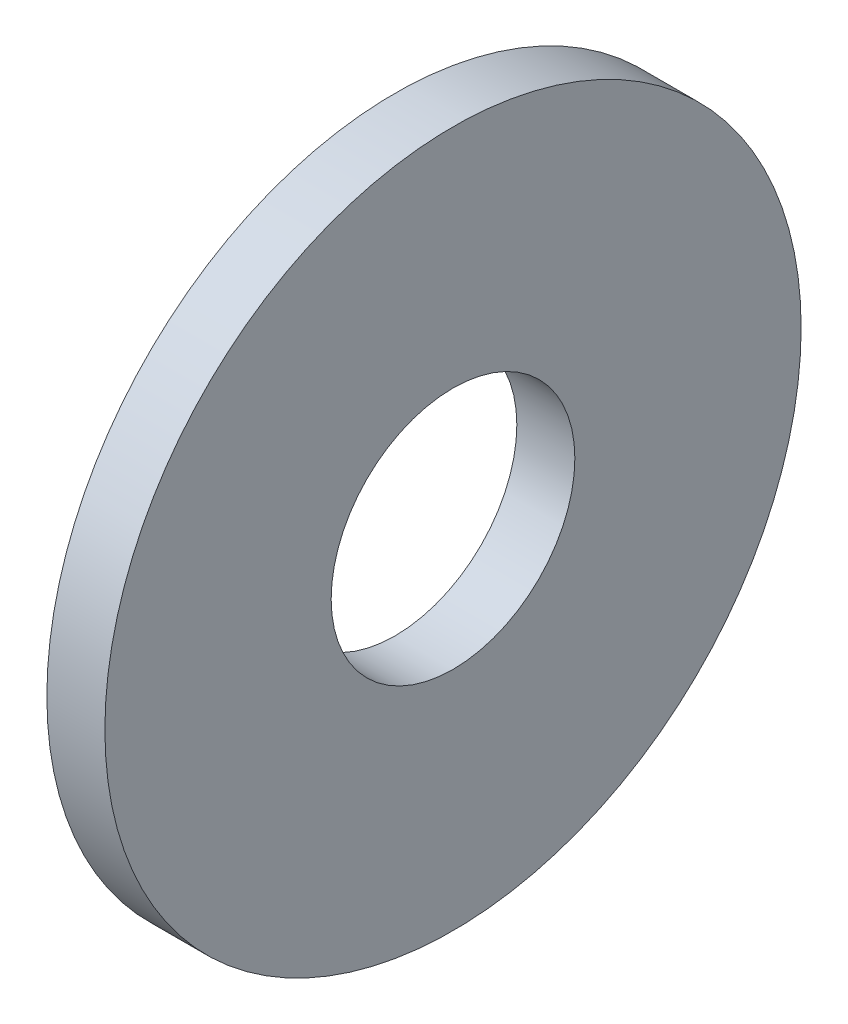
ISO-10303-21;
HEADER;
FILE_DESCRIPTION(('STEP AP214'),'2;1');
FILE_NAME('part.step','',(''),(''),'','','');
FILE_SCHEMA(('AUTOMOTIVE_DESIGN { 1 0 10303 214 1 1 1 1 }'));
ENDSEC;
DATA;
#1=APPLICATION_CONTEXT('core data for automotive mechanical design processes');
#2=APPLICATION_PROTOCOL_DEFINITION('international standard','automotive_design',2000,#1);
#3=PRODUCT_CONTEXT('',#1,'mechanical');
#4=PRODUCT('Part','Part','',(#3));
#5=PRODUCT_RELATED_PRODUCT_CATEGORY('part','',(#4));
#6=PRODUCT_DEFINITION_FORMATION('','',#4);
#7=PRODUCT_DEFINITION_CONTEXT('part definition',#1,'design');
#8=PRODUCT_DEFINITION('design','',#6,#7);
#9=PRODUCT_DEFINITION_SHAPE('','',#8);
#10=(LENGTH_UNIT() NAMED_UNIT(*) SI_UNIT(.MILLI.,.METRE.));
#11=(NAMED_UNIT(*) PLANE_ANGLE_UNIT() SI_UNIT($,.RADIAN.));
#12=(NAMED_UNIT(*) SI_UNIT($,.STERADIAN.) SOLID_ANGLE_UNIT());
#13=UNCERTAINTY_MEASURE_WITH_UNIT(LENGTH_MEASURE(1.E-05),#10,'distance_accuracy_value','');
#14=(GEOMETRIC_REPRESENTATION_CONTEXT(3) GLOBAL_UNCERTAINTY_ASSIGNED_CONTEXT((#13)) GLOBAL_UNIT_ASSIGNED_CONTEXT((#10,
#11,#12)) REPRESENTATION_CONTEXT('',''));
#15=CARTESIAN_POINT('',(0.,0.,0.));
#16=DIRECTION('',(0.,0.,1.));
#17=DIRECTION('',(1.,0.,0.));
#18=AXIS2_PLACEMENT_3D('',#15,#16,#17);
#19=CARTESIAN_POINT('',(-34.9249999999999,0.,0.));
#20=DIRECTION('',(-1.,0.,0.));
#21=DIRECTION('',(0.,0.,1.));
#22=AXIS2_PLACEMENT_3D('',#19,#20,#21);
#23=CYLINDRICAL_SURFACE('',#22,4.2);
#24=CARTESIAN_POINT('',(0.,0.,0.));
#25=DIRECTION('',(-1.,0.,0.));
#26=DIRECTION('',(0.,0.,1.));
#27=AXIS2_PLACEMENT_3D('',#24,#25,#26);
#28=CIRCLE('',#27,4.2);
#29=CARTESIAN_POINT('',(0.,0.,4.2));
#30=VERTEX_POINT('',#29);
#31=EDGE_CURVE('E10',#30,#30,#28,.T.);
#32=ORIENTED_EDGE('',*,*,#31,.F.);
#33=EDGE_LOOP('',(#32));
#34=FACE_BOUND('',#33,.T.);
#35=CARTESIAN_POINT('',(-2.,0.,0.));
#36=DIRECTION('',(-1.,0.,0.));
#37=DIRECTION('',(0.,0.,1.));
#38=AXIS2_PLACEMENT_3D('',#35,#36,#37);
#39=CIRCLE('',#38,4.2);
#40=CARTESIAN_POINT('',(-2.,0.,4.2));
#41=VERTEX_POINT('',#40);
#42=EDGE_CURVE('E44',#41,#41,#39,.T.);
#43=ORIENTED_EDGE('',*,*,#42,.T.);
#44=EDGE_LOOP('',(#43));
#45=FACE_BOUND('',#44,.T.);
#46=ADVANCED_FACE('F30',(#34,#45),#23,.F.);
#47=CARTESIAN_POINT('',(0.,4.2,0.));
#48=DIRECTION('',(-1.,0.,0.));
#49=DIRECTION('',(0.,0.,1.));
#50=AXIS2_PLACEMENT_3D('',#47,#48,#49);
#51=PLANE('',#50);
#52=CARTESIAN_POINT('',(0.,0.,0.));
#53=DIRECTION('',(-1.,0.,0.));
#54=DIRECTION('',(0.,0.,1.));
#55=AXIS2_PLACEMENT_3D('',#52,#53,#54);
#56=CIRCLE('',#55,12.);
#57=CARTESIAN_POINT('',(0.,0.,12.));
#58=VERTEX_POINT('',#57);
#59=EDGE_CURVE('E36',#58,#58,#56,.T.);
#60=ORIENTED_EDGE('',*,*,#59,.F.);
#61=EDGE_LOOP('',(#60));
#62=FACE_BOUND('',#61,.T.);
#63=ORIENTED_EDGE('',*,*,#31,.T.);
#64=EDGE_LOOP('',(#63));
#65=FACE_BOUND('',#64,.T.);
#66=ADVANCED_FACE('F59',(#62,#65),#51,.F.);
#67=CARTESIAN_POINT('',(-34.9249999999999,0.,0.));
#68=DIRECTION('',(-1.,0.,0.));
#69=DIRECTION('',(0.,0.,1.));
#70=AXIS2_PLACEMENT_3D('',#67,#68,#69);
#71=CYLINDRICAL_SURFACE('',#70,12.);
#72=CARTESIAN_POINT('',(-2.,0.,0.));
#73=DIRECTION('',(-1.,0.,0.));
#74=DIRECTION('',(0.,0.,1.));
#75=AXIS2_PLACEMENT_3D('',#72,#73,#74);
#76=CIRCLE('',#75,12.);
#77=CARTESIAN_POINT('',(-2.,0.,12.));
#78=VERTEX_POINT('',#77);
#79=EDGE_CURVE('E40',#78,#78,#76,.T.);
#80=ORIENTED_EDGE('',*,*,#79,.F.);
#81=EDGE_LOOP('',(#80));
#82=FACE_BOUND('',#81,.T.);
#83=ORIENTED_EDGE('',*,*,#59,.T.);
#84=EDGE_LOOP('',(#83));
#85=FACE_BOUND('',#84,.T.);
#86=ADVANCED_FACE('F54',(#82,#85),#71,.T.);
#87=CARTESIAN_POINT('',(-2.,12.,0.));
#88=DIRECTION('',(1.,0.,0.));
#89=DIRECTION('',(0.,0.,-1.));
#90=AXIS2_PLACEMENT_3D('',#87,#88,#89);
#91=PLANE('',#90);
#92=ORIENTED_EDGE('',*,*,#42,.F.);
#93=EDGE_LOOP('',(#92));
#94=FACE_BOUND('',#93,.T.);
#95=ORIENTED_EDGE('',*,*,#79,.T.);
#96=EDGE_LOOP('',(#95));
#97=FACE_BOUND('',#96,.T.);
#98=ADVANCED_FACE('F51',(#94,#97),#91,.F.);
#99=CLOSED_SHELL('',(#46,#66,#86,#98));
#100=MANIFOLD_SOLID_BREP('B2',#99);
#101=ADVANCED_BREP_SHAPE_REPRESENTATION('',(#18,#100),#14);
#102=SHAPE_DEFINITION_REPRESENTATION(#9,#101);
ENDSEC;
END-ISO-10303-21;
